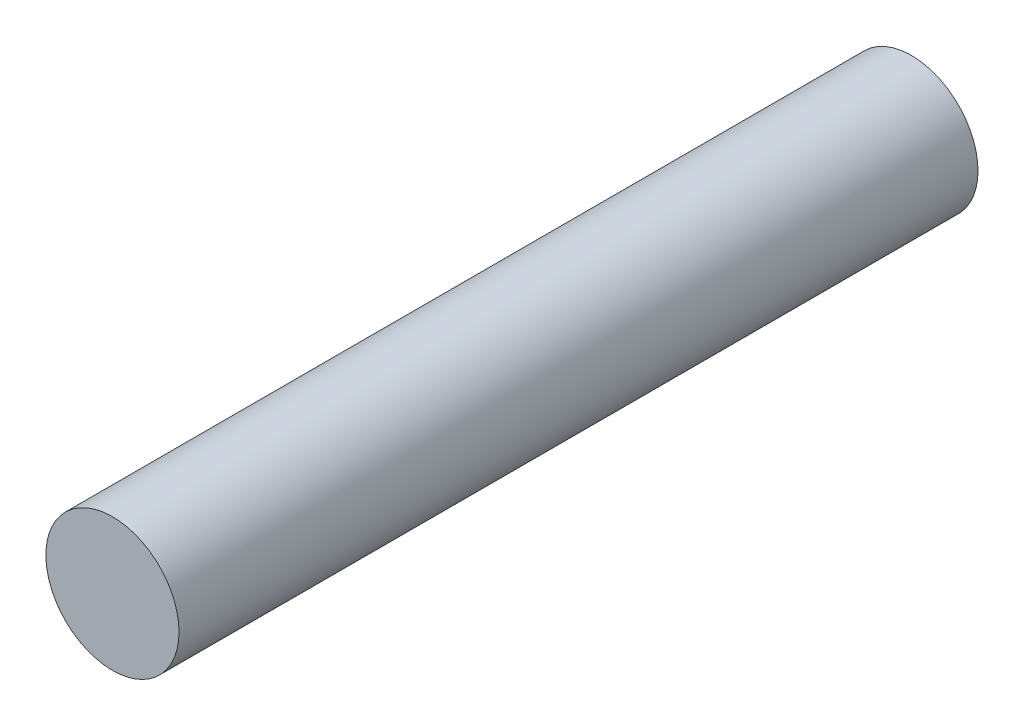
ISO-10303-21;
HEADER;
FILE_DESCRIPTION(('STEP AP214'),'2;1');
FILE_NAME('part.step','',(''),(''),'','','');
FILE_SCHEMA(('AUTOMOTIVE_DESIGN { 1 0 10303 214 1 1 1 1 }'));
ENDSEC;
DATA;
#1=APPLICATION_CONTEXT('core data for automotive mechanical design processes');
#2=APPLICATION_PROTOCOL_DEFINITION('international standard','automotive_design',2000,#1);
#3=PRODUCT_CONTEXT('',#1,'mechanical');
#4=PRODUCT('Part','Part','',(#3));
#5=PRODUCT_RELATED_PRODUCT_CATEGORY('part','',(#4));
#6=PRODUCT_DEFINITION_FORMATION('','',#4);
#7=PRODUCT_DEFINITION_CONTEXT('part definition',#1,'design');
#8=PRODUCT_DEFINITION('design','',#6,#7);
#9=PRODUCT_DEFINITION_SHAPE('','',#8);
#10=(LENGTH_UNIT() NAMED_UNIT(*) SI_UNIT(.MILLI.,.METRE.));
#11=(NAMED_UNIT(*) PLANE_ANGLE_UNIT() SI_UNIT($,.RADIAN.));
#12=(NAMED_UNIT(*) SI_UNIT($,.STERADIAN.) SOLID_ANGLE_UNIT());
#13=UNCERTAINTY_MEASURE_WITH_UNIT(LENGTH_MEASURE(1.E-05),#10,'distance_accuracy_value','');
#14=(GEOMETRIC_REPRESENTATION_CONTEXT(3) GLOBAL_UNCERTAINTY_ASSIGNED_CONTEXT((#13)) GLOBAL_UNIT_ASSIGNED_CONTEXT((#10,
#11,#12)) REPRESENTATION_CONTEXT('',''));
#15=CARTESIAN_POINT('',(0.,0.,0.));
#16=DIRECTION('',(0.,0.,1.));
#17=DIRECTION('',(1.,0.,0.));
#18=AXIS2_PLACEMENT_3D('',#15,#16,#17);
#19=CARTESIAN_POINT('',(0.,0.,30.));
#20=DIRECTION('',(0.,0.,-1.));
#21=DIRECTION('',(-1.,0.,0.));
#22=AXIS2_PLACEMENT_3D('',#19,#20,#21);
#23=CYLINDRICAL_SURFACE('',#22,2.5);
#24=CARTESIAN_POINT('',(0.,0.,30.));
#25=DIRECTION('',(0.,0.,1.));
#26=DIRECTION('',(1.,0.,0.));
#27=AXIS2_PLACEMENT_3D('',#24,#25,#26);
#28=CIRCLE('',#27,2.5);
#29=CARTESIAN_POINT('',(2.5,0.,30.));
#30=VERTEX_POINT('',#29);
#31=EDGE_CURVE('E10',#30,#30,#28,.T.);
#32=ORIENTED_EDGE('',*,*,#31,.F.);
#33=EDGE_LOOP('',(#32));
#34=FACE_BOUND('',#33,.T.);
#35=CARTESIAN_POINT('',(0.,0.,0.));
#36=DIRECTION('',(0.,0.,1.));
#37=DIRECTION('',(1.,0.,0.));
#38=AXIS2_PLACEMENT_3D('',#35,#36,#37);
#39=CIRCLE('',#38,2.5);
#40=CARTESIAN_POINT('',(2.5,0.,0.));
#41=VERTEX_POINT('',#40);
#42=EDGE_CURVE('E40',#41,#41,#39,.T.);
#43=ORIENTED_EDGE('',*,*,#42,.T.);
#44=EDGE_LOOP('',(#43));
#45=FACE_BOUND('',#44,.T.);
#46=ADVANCED_FACE('F37',(#34,#45),#23,.T.);
#47=CARTESIAN_POINT('',(0.,0.,30.));
#48=DIRECTION('',(0.,0.,1.));
#49=DIRECTION('',(1.,0.,0.));
#50=AXIS2_PLACEMENT_3D('',#47,#48,#49);
#51=PLANE('',#50);
#52=ORIENTED_EDGE('',*,*,#31,.T.);
#53=EDGE_LOOP('',(#52));
#54=FACE_BOUND('',#53,.T.);
#55=ADVANCED_FACE('F52',(#54),#51,.T.);
#56=CARTESIAN_POINT('',(0.,0.,0.));
#57=DIRECTION('',(0.,0.,1.));
#58=DIRECTION('',(1.,0.,0.));
#59=AXIS2_PLACEMENT_3D('',#56,#57,#58);
#60=PLANE('',#59);
#61=ORIENTED_EDGE('',*,*,#42,.F.);
#62=EDGE_LOOP('',(#61));
#63=FACE_BOUND('',#62,.T.);
#64=ADVANCED_FACE('F50',(#63),#60,.F.);
#65=CLOSED_SHELL('',(#46,#55,#64));
#66=MANIFOLD_SOLID_BREP('B2',#65);
#67=ADVANCED_BREP_SHAPE_REPRESENTATION('',(#18,#66),#14);
#68=SHAPE_DEFINITION_REPRESENTATION(#9,#67);
ENDSEC;
END-ISO-10303-21;
